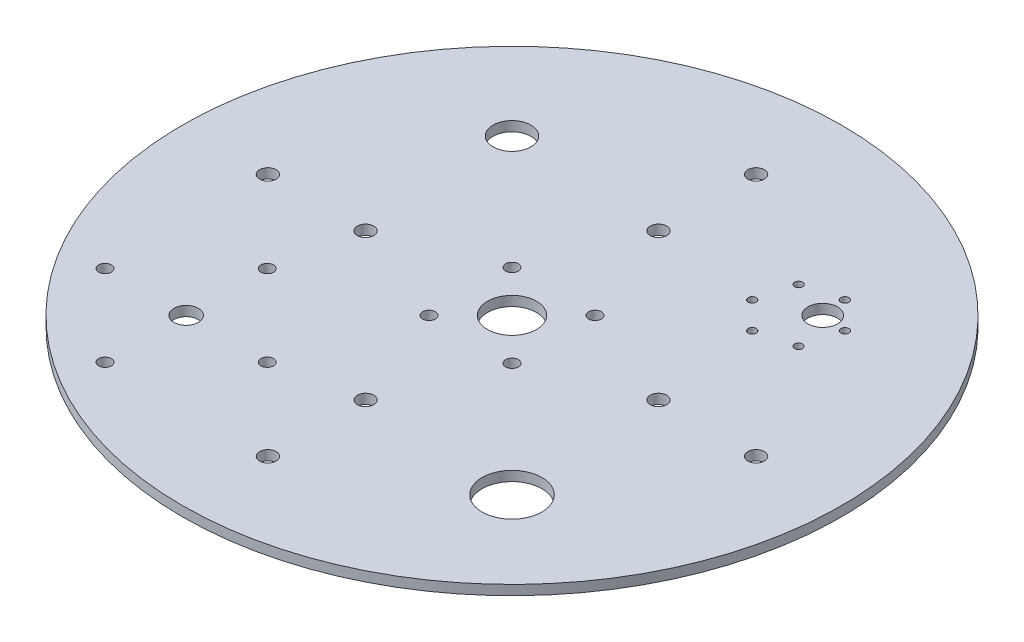
ISO-10303-21;
HEADER;
FILE_DESCRIPTION(('STEP AP214'),'2;1');
FILE_NAME('part.step','',(''),(''),'','','');
FILE_SCHEMA(('AUTOMOTIVE_DESIGN { 1 0 10303 214 1 1 1 1 }'));
ENDSEC;
DATA;
#1=APPLICATION_CONTEXT('core data for automotive mechanical design processes');
#2=APPLICATION_PROTOCOL_DEFINITION('international standard','automotive_design',2000,#1);
#3=PRODUCT_CONTEXT('',#1,'mechanical');
#4=PRODUCT('Part','Part','',(#3));
#5=PRODUCT_RELATED_PRODUCT_CATEGORY('part','',(#4));
#6=PRODUCT_DEFINITION_FORMATION('','',#4);
#7=PRODUCT_DEFINITION_CONTEXT('part definition',#1,'design');
#8=PRODUCT_DEFINITION('design','',#6,#7);
#9=PRODUCT_DEFINITION_SHAPE('','',#8);
#10=(LENGTH_UNIT() NAMED_UNIT(*) SI_UNIT(.MILLI.,.METRE.));
#11=(NAMED_UNIT(*) PLANE_ANGLE_UNIT() SI_UNIT($,.RADIAN.));
#12=(NAMED_UNIT(*) SI_UNIT($,.STERADIAN.) SOLID_ANGLE_UNIT());
#13=UNCERTAINTY_MEASURE_WITH_UNIT(LENGTH_MEASURE(1.E-05),#10,'distance_accuracy_value','');
#14=(GEOMETRIC_REPRESENTATION_CONTEXT(3) GLOBAL_UNCERTAINTY_ASSIGNED_CONTEXT((#13)) GLOBAL_UNIT_ASSIGNED_CONTEXT((#10,
#11,#12)) REPRESENTATION_CONTEXT('',''));
#15=CARTESIAN_POINT('',(0.,0.,0.));
#16=DIRECTION('',(0.,0.,1.));
#17=DIRECTION('',(1.,0.,0.));
#18=AXIS2_PLACEMENT_3D('',#15,#16,#17);
#19=CARTESIAN_POINT('',(0.,-4.,0.));
#20=DIRECTION('',(0.,1.,0.));
#21=DIRECTION('',(0.,0.,1.));
#22=AXIS2_PLACEMENT_3D('',#19,#20,#21);
#23=CYLINDRICAL_SURFACE('',#22,135.);
#24=CARTESIAN_POINT('',(0.,-4.,0.));
#25=DIRECTION('',(0.,1.,0.));
#26=DIRECTION('',(0.,0.,1.));
#27=AXIS2_PLACEMENT_3D('',#24,#25,#26);
#28=CIRCLE('',#27,135.);
#29=CARTESIAN_POINT('',(0.,-4.,135.));
#30=VERTEX_POINT('',#29);
#31=EDGE_CURVE('E10',#30,#30,#28,.T.);
#32=ORIENTED_EDGE('',*,*,#31,.T.);
#33=EDGE_LOOP('',(#32));
#34=FACE_BOUND('',#33,.T.);
#35=CARTESIAN_POINT('',(0.,0.,0.));
#36=DIRECTION('',(0.,1.,0.));
#37=DIRECTION('',(0.,0.,1.));
#38=AXIS2_PLACEMENT_3D('',#35,#36,#37);
#39=CIRCLE('',#38,135.);
#40=CARTESIAN_POINT('',(0.,0.,135.));
#41=VERTEX_POINT('',#40);
#42=EDGE_CURVE('E41',#41,#41,#39,.T.);
#43=ORIENTED_EDGE('',*,*,#42,.F.);
#44=EDGE_LOOP('',(#43));
#45=FACE_BOUND('',#44,.T.);
#46=ADVANCED_FACE('F38',(#34,#45),#23,.T.);
#47=CARTESIAN_POINT('',(0.,-4.,0.));
#48=DIRECTION('',(0.,1.,0.));
#49=DIRECTION('',(0.,0.,1.));
#50=AXIS2_PLACEMENT_3D('',#47,#48,#49);
#51=PLANE('',#50);
#52=CARTESIAN_POINT('',(-66.7446383646597,-4.,66.7446383646597));
#53=DIRECTION('',(0.,1.,0.));
#54=DIRECTION('',(0.,0.,1.));
#55=AXIS2_PLACEMENT_3D('',#52,#53,#54);
#56=CIRCLE('',#55,5.00000000000001);
#57=CARTESIAN_POINT('',(-66.7446383646597,-4.,71.7446383646597));
#58=VERTEX_POINT('',#57);
#59=EDGE_CURVE('E205',#58,#58,#56,.T.);
#60=ORIENTED_EDGE('',*,*,#59,.T.);
#61=EDGE_LOOP('',(#60));
#62=FACE_BOUND('',#61,.T.);
#63=CARTESIAN_POINT('',(-33.510619648892,-4.,66.7446383646597));
#64=DIRECTION('',(0.,1.,0.));
#65=DIRECTION('',(0.,0.,1.));
#66=AXIS2_PLACEMENT_3D('',#63,#64,#65);
#67=CIRCLE('',#66,2.59999999999999);
#68=CARTESIAN_POINT('',(-33.510619648892,-4.,69.3446383646597));
#69=VERTEX_POINT('',#68);
#70=EDGE_CURVE('E199',#69,#69,#67,.T.);
#71=ORIENTED_EDGE('',*,*,#70,.T.);
#72=EDGE_LOOP('',(#71));
#73=FACE_BOUND('',#72,.T.);
#74=CARTESIAN_POINT('',(-66.7446383646597,-4.,99.9786570804274));
#75=DIRECTION('',(0.,1.,0.));
#76=DIRECTION('',(0.,0.,1.));
#77=AXIS2_PLACEMENT_3D('',#74,#75,#76);
#78=CIRCLE('',#77,2.6);
#79=CARTESIAN_POINT('',(-66.7446383646597,-4.,102.578657080427));
#80=VERTEX_POINT('',#79);
#81=EDGE_CURVE('E193',#80,#80,#78,.T.);
#82=ORIENTED_EDGE('',*,*,#81,.T.);
#83=EDGE_LOOP('',(#82));
#84=FACE_BOUND('',#83,.T.);
#85=CARTESIAN_POINT('',(-99.9786570804275,-4.,66.7446383646597));
#86=DIRECTION('',(0.,1.,0.));
#87=DIRECTION('',(0.,0.,1.));
#88=AXIS2_PLACEMENT_3D('',#85,#86,#87);
#89=CIRCLE('',#88,2.6);
#90=CARTESIAN_POINT('',(-99.9786570804275,-4.,69.3446383646597));
#91=VERTEX_POINT('',#90);
#92=EDGE_CURVE('E187',#91,#91,#89,.T.);
#93=ORIENTED_EDGE('',*,*,#92,.T.);
#94=EDGE_LOOP('',(#93));
#95=FACE_BOUND('',#94,.T.);
#96=CARTESIAN_POINT('',(-66.7446383646597,-4.,33.510619648892));
#97=DIRECTION('',(0.,1.,0.));
#98=DIRECTION('',(0.,0.,1.));
#99=AXIS2_PLACEMENT_3D('',#96,#97,#98);
#100=CIRCLE('',#99,2.6);
#101=CARTESIAN_POINT('',(-66.7446383646597,-4.,36.110619648892));
#102=VERTEX_POINT('',#101);
#103=EDGE_CURVE('E181',#102,#102,#100,.T.);
#104=ORIENTED_EDGE('',*,*,#103,.T.);
#105=EDGE_LOOP('',(#104));
#106=FACE_BOUND('',#105,.T.);
#107=CARTESIAN_POINT('',(17.,-4.,-17.));
#108=DIRECTION('',(0.,1.,0.));
#109=DIRECTION('',(0.,0.,1.));
#110=AXIS2_PLACEMENT_3D('',#107,#108,#109);
#111=CIRCLE('',#110,2.6);
#112=CARTESIAN_POINT('',(17.,-4.,-14.4));
#113=VERTEX_POINT('',#112);
#114=EDGE_CURVE('E175',#113,#113,#111,.T.);
#115=ORIENTED_EDGE('',*,*,#114,.T.);
#116=EDGE_LOOP('',(#115));
#117=FACE_BOUND('',#116,.T.);
#118=CARTESIAN_POINT('',(-17.,-4.,-17.));
#119=DIRECTION('',(0.,1.,0.));
#120=DIRECTION('',(0.,0.,1.));
#121=AXIS2_PLACEMENT_3D('',#118,#119,#120);
#122=CIRCLE('',#121,2.6);
#123=CARTESIAN_POINT('',(-17.,-4.,-14.4));
#124=VERTEX_POINT('',#123);
#125=EDGE_CURVE('E169',#124,#124,#122,.T.);
#126=ORIENTED_EDGE('',*,*,#125,.T.);
#127=EDGE_LOOP('',(#126));
#128=FACE_BOUND('',#127,.T.);
#129=CARTESIAN_POINT('',(-17.,-4.,17.));
#130=DIRECTION('',(0.,1.,0.));
#131=DIRECTION('',(0.,0.,1.));
#132=AXIS2_PLACEMENT_3D('',#129,#130,#131);
#133=CIRCLE('',#132,2.6);
#134=CARTESIAN_POINT('',(-17.,-4.,19.6));
#135=VERTEX_POINT('',#134);
#136=EDGE_CURVE('E163',#135,#135,#133,.T.);
#137=ORIENTED_EDGE('',*,*,#136,.T.);
#138=EDGE_LOOP('',(#137));
#139=FACE_BOUND('',#138,.T.);
#140=CARTESIAN_POINT('',(17.,-4.,17.));
#141=DIRECTION('',(0.,1.,0.));
#142=DIRECTION('',(0.,0.,1.));
#143=AXIS2_PLACEMENT_3D('',#140,#141,#142);
#144=CIRCLE('',#143,2.6);
#145=CARTESIAN_POINT('',(17.,-4.,19.6));
#146=VERTEX_POINT('',#145);
#147=EDGE_CURVE('E157',#146,#146,#144,.T.);
#148=ORIENTED_EDGE('',*,*,#147,.T.);
#149=EDGE_LOOP('',(#148));
#150=FACE_BOUND('',#149,.T.);
#151=CARTESIAN_POINT('',(0.,-4.,0.));
#152=DIRECTION('',(0.,1.,0.));
#153=DIRECTION('',(0.,0.,1.));
#154=AXIS2_PLACEMENT_3D('',#151,#152,#153);
#155=CIRCLE('',#154,10.05);
#156=CARTESIAN_POINT('',(0.,-4.,10.05));
#157=VERTEX_POINT('',#156);
#158=EDGE_CURVE('E151',#157,#157,#155,.T.);
#159=ORIENTED_EDGE('',*,*,#158,.T.);
#160=EDGE_LOOP('',(#159));
#161=FACE_BOUND('',#160,.T.);
#162=CARTESIAN_POINT('',(100.,-4.,0.));
#163=DIRECTION('',(0.,1.,0.));
#164=DIRECTION('',(0.,0.,1.));
#165=AXIS2_PLACEMENT_3D('',#162,#163,#164);
#166=CIRCLE('',#165,3.3782);
#167=CARTESIAN_POINT('',(100.,-4.,3.3782));
#168=VERTEX_POINT('',#167);
#169=EDGE_CURVE('E145',#168,#168,#166,.T.);
#170=ORIENTED_EDGE('',*,*,#169,.T.);
#171=EDGE_LOOP('',(#170));
#172=FACE_BOUND('',#171,.T.);
#173=CARTESIAN_POINT('',(60.,-4.,0.));
#174=DIRECTION('',(0.,1.,0.));
#175=DIRECTION('',(0.,0.,1.));
#176=AXIS2_PLACEMENT_3D('',#173,#174,#175);
#177=CIRCLE('',#176,3.3782);
#178=CARTESIAN_POINT('',(60.,-4.,3.37820000000001));
#179=VERTEX_POINT('',#178);
#180=EDGE_CURVE('E139',#179,#179,#177,.T.);
#181=ORIENTED_EDGE('',*,*,#180,.T.);
#182=EDGE_LOOP('',(#181));
#183=FACE_BOUND('',#182,.T.);
#184=CARTESIAN_POINT('',(0.,-4.,100.));
#185=DIRECTION('',(0.,1.,0.));
#186=DIRECTION('',(0.,0.,1.));
#187=AXIS2_PLACEMENT_3D('',#184,#185,#186);
#188=CIRCLE('',#187,3.3782);
#189=CARTESIAN_POINT('',(0.,-4.,103.3782));
#190=VERTEX_POINT('',#189);
#191=EDGE_CURVE('E133',#190,#190,#188,.T.);
#192=ORIENTED_EDGE('',*,*,#191,.T.);
#193=EDGE_LOOP('',(#192));
#194=FACE_BOUND('',#193,.T.);
#195=CARTESIAN_POINT('',(-2.20510701522914E-13,-4.,60.));
#196=DIRECTION('',(0.,1.,0.));
#197=DIRECTION('',(0.,0.,1.));
#198=AXIS2_PLACEMENT_3D('',#195,#196,#197);
#199=CIRCLE('',#198,3.3782);
#200=CARTESIAN_POINT('',(-2.20510701522914E-13,-4.,63.3782));
#201=VERTEX_POINT('',#200);
#202=EDGE_CURVE('E127',#201,#201,#199,.T.);
#203=ORIENTED_EDGE('',*,*,#202,.T.);
#204=EDGE_LOOP('',(#203));
#205=FACE_BOUND('',#204,.T.);
#206=CARTESIAN_POINT('',(-100.,-4.,0.));
#207=DIRECTION('',(0.,1.,0.));
#208=DIRECTION('',(0.,0.,1.));
#209=AXIS2_PLACEMENT_3D('',#206,#207,#208);
#210=CIRCLE('',#209,3.3782);
#211=CARTESIAN_POINT('',(-100.,-4.,3.37820000000001));
#212=VERTEX_POINT('',#211);
#213=EDGE_CURVE('E121',#212,#212,#210,.T.);
#214=ORIENTED_EDGE('',*,*,#213,.T.);
#215=EDGE_LOOP('',(#214));
#216=FACE_BOUND('',#215,.T.);
#217=CARTESIAN_POINT('',(-60.,-4.,-4.29999581853502E-13));
#218=DIRECTION('',(0.,1.,0.));
#219=DIRECTION('',(0.,0.,1.));
#220=AXIS2_PLACEMENT_3D('',#217,#218,#219);
#221=CIRCLE('',#220,3.3782);
#222=CARTESIAN_POINT('',(-60.,-4.,3.37819999999957));
#223=VERTEX_POINT('',#222);
#224=EDGE_CURVE('E115',#223,#223,#221,.T.);
#225=ORIENTED_EDGE('',*,*,#224,.T.);
#226=EDGE_LOOP('',(#225));
#227=FACE_BOUND('',#226,.T.);
#228=CARTESIAN_POINT('',(0.,-4.,-100.));
#229=DIRECTION('',(0.,1.,0.));
#230=DIRECTION('',(0.,0.,1.));
#231=AXIS2_PLACEMENT_3D('',#228,#229,#230);
#232=CIRCLE('',#231,3.3782);
#233=CARTESIAN_POINT('',(0.,-4.,-96.6218));
#234=VERTEX_POINT('',#233);
#235=EDGE_CURVE('E109',#234,#234,#232,.T.);
#236=ORIENTED_EDGE('',*,*,#235,.T.);
#237=EDGE_LOOP('',(#236));
#238=FACE_BOUND('',#237,.T.);
#239=CARTESIAN_POINT('',(6.32549568280183E-13,-4.,-60.));
#240=DIRECTION('',(0.,1.,0.));
#241=DIRECTION('',(0.,0.,1.));
#242=AXIS2_PLACEMENT_3D('',#239,#240,#241);
#243=CIRCLE('',#242,3.3782);
#244=CARTESIAN_POINT('',(6.32549568280183E-13,-4.,-56.6218));
#245=VERTEX_POINT('',#244);
#246=EDGE_CURVE('E103',#245,#245,#243,.T.);
#247=ORIENTED_EDGE('',*,*,#246,.T.);
#248=EDGE_LOOP('',(#247));
#249=FACE_BOUND('',#248,.T.);
#250=CARTESIAN_POINT('',(54.6781676393946,-4.,-43.7180125310026));
#251=DIRECTION('',(0.,1.,0.));
#252=DIRECTION('',(0.,0.,1.));
#253=AXIS2_PLACEMENT_3D('',#250,#251,#252);
#254=CIRCLE('',#253,1.65);
#255=CARTESIAN_POINT('',(54.6781676393946,-4.,-42.0680125310026));
#256=VERTEX_POINT('',#255);
#257=EDGE_CURVE('E97',#256,#256,#254,.T.);
#258=ORIENTED_EDGE('',*,*,#257,.T.);
#259=EDGE_LOOP('',(#258));
#260=FACE_BOUND('',#259,.T.);
#261=CARTESIAN_POINT('',(69.6500179468752,-4.,-47.7297077300916));
#262=DIRECTION('',(0.,1.,0.));
#263=DIRECTION('',(0.,0.,1.));
#264=AXIS2_PLACEMENT_3D('',#261,#262,#263);
#265=CIRCLE('',#264,1.65);
#266=CARTESIAN_POINT('',(69.6500179468752,-4.,-46.0797077300916));
#267=VERTEX_POINT('',#266);
#268=EDGE_CURVE('E91',#267,#267,#265,.T.);
#269=ORIENTED_EDGE('',*,*,#268,.T.);
#270=EDGE_LOOP('',(#269));
#271=FACE_BOUND('',#270,.T.);
#272=CARTESIAN_POINT('',(47.7297077300923,-4.,-69.6500179468747));
#273=DIRECTION('',(0.,1.,0.));
#274=DIRECTION('',(0.,0.,1.));
#275=AXIS2_PLACEMENT_3D('',#272,#273,#274);
#276=CIRCLE('',#275,1.65);
#277=CARTESIAN_POINT('',(47.7297077300923,-4.,-68.0000179468747));
#278=VERTEX_POINT('',#277);
#279=EDGE_CURVE('E85',#278,#278,#276,.T.);
#280=ORIENTED_EDGE('',*,*,#279,.T.);
#281=EDGE_LOOP('',(#280));
#282=FACE_BOUND('',#281,.T.);
#283=CARTESIAN_POINT('',(62.7015580375729,-4.,-73.6617131459636));
#284=DIRECTION('',(0.,1.,0.));
#285=DIRECTION('',(0.,0.,1.));
#286=AXIS2_PLACEMENT_3D('',#283,#284,#285);
#287=CIRCLE('',#286,1.65);
#288=CARTESIAN_POINT('',(62.7015580375729,-4.,-72.0117131459636));
#289=VERTEX_POINT('',#288);
#290=EDGE_CURVE('E79',#289,#289,#287,.T.);
#291=ORIENTED_EDGE('',*,*,#290,.T.);
#292=EDGE_LOOP('',(#291));
#293=FACE_BOUND('',#292,.T.);
#294=CARTESIAN_POINT('',(73.6617131459643,-4.,-62.7015580375721));
#295=DIRECTION('',(0.,1.,0.));
#296=DIRECTION('',(0.,0.,1.));
#297=AXIS2_PLACEMENT_3D('',#294,#295,#296);
#298=CIRCLE('',#297,1.65);
#299=CARTESIAN_POINT('',(73.6617131459643,-4.,-61.0515580375721));
#300=VERTEX_POINT('',#299);
#301=EDGE_CURVE('E73',#300,#300,#298,.T.);
#302=ORIENTED_EDGE('',*,*,#301,.T.);
#303=EDGE_LOOP('',(#302));
#304=FACE_BOUND('',#303,.T.);
#305=CARTESIAN_POINT('',(43.7180125310032,-4.,-54.6781676393941));
#306=DIRECTION('',(0.,1.,0.));
#307=DIRECTION('',(0.,0.,1.));
#308=AXIS2_PLACEMENT_3D('',#305,#306,#307);
#309=CIRCLE('',#308,1.65);
#310=CARTESIAN_POINT('',(43.7180125310032,-4.,-53.0281676393941));
#311=VERTEX_POINT('',#310);
#312=EDGE_CURVE('E67',#311,#311,#309,.T.);
#313=ORIENTED_EDGE('',*,*,#312,.T.);
#314=EDGE_LOOP('',(#313));
#315=FACE_BOUND('',#314,.T.);
#316=CARTESIAN_POINT('',(-63.6396103067873,-4.,-63.6396103067879));
#317=DIRECTION('',(0.,1.,0.));
#318=DIRECTION('',(0.,0.,1.));
#319=AXIS2_PLACEMENT_3D('',#316,#317,#318);
#320=CIRCLE('',#319,7.74999999999789);
#321=CARTESIAN_POINT('',(-63.6396103067873,-4.,-55.88961030679));
#322=VERTEX_POINT('',#321);
#323=EDGE_CURVE('E61',#322,#322,#320,.T.);
#324=ORIENTED_EDGE('',*,*,#323,.T.);
#325=EDGE_LOOP('',(#324));
#326=FACE_BOUND('',#325,.T.);
#327=CARTESIAN_POINT('',(63.6396103067906,-4.,63.6396103067913));
#328=DIRECTION('',(0.,1.,0.));
#329=DIRECTION('',(0.,0.,1.));
#330=AXIS2_PLACEMENT_3D('',#327,#328,#329);
#331=CIRCLE('',#330,12.2500000000021);
#332=CARTESIAN_POINT('',(63.6396103067906,-4.,75.8896103067933));
#333=VERTEX_POINT('',#332);
#334=EDGE_CURVE('E55',#333,#333,#331,.T.);
#335=ORIENTED_EDGE('',*,*,#334,.T.);
#336=EDGE_LOOP('',(#335));
#337=FACE_BOUND('',#336,.T.);
#338=CARTESIAN_POINT('',(63.6396103067896,-4.,-63.6396103067889));
#339=DIRECTION('',(0.,1.,0.));
#340=DIRECTION('',(0.,0.,1.));
#341=AXIS2_PLACEMENT_3D('',#338,#339,#340);
#342=CIRCLE('',#341,6.05);
#343=CARTESIAN_POINT('',(63.6396103067896,-4.,-57.5896103067889));
#344=VERTEX_POINT('',#343);
#345=EDGE_CURVE('E48',#344,#344,#342,.T.);
#346=ORIENTED_EDGE('',*,*,#345,.T.);
#347=EDGE_LOOP('',(#346));
#348=FACE_BOUND('',#347,.T.);
#349=ORIENTED_EDGE('',*,*,#31,.F.);
#350=EDGE_LOOP('',(#349));
#351=FACE_BOUND('',#350,.T.);
#352=ADVANCED_FACE('F212',(#62,#73,#84,#95,#106,#117,#128,#139,#150,#161,#172,#183,#194,#205,
#216,#227,#238,#249,#260,#271,#282,#293,#304,#315,#326,#337,#348,#351),#51,.F.);
#353=CARTESIAN_POINT('',(0.,0.,0.));
#354=DIRECTION('',(0.,1.,0.));
#355=DIRECTION('',(0.,0.,1.));
#356=AXIS2_PLACEMENT_3D('',#353,#354,#355);
#357=PLANE('',#356);
#358=CARTESIAN_POINT('',(-66.7446383646597,0.,66.7446383646597));
#359=DIRECTION('',(0.,1.,0.));
#360=DIRECTION('',(0.,0.,1.));
#361=AXIS2_PLACEMENT_3D('',#358,#359,#360);
#362=CIRCLE('',#361,5.00000000000001);
#363=CARTESIAN_POINT('',(-66.7446383646597,0.,71.7446383646597));
#364=VERTEX_POINT('',#363);
#365=EDGE_CURVE('E206',#364,#364,#362,.T.);
#366=ORIENTED_EDGE('',*,*,#365,.F.);
#367=EDGE_LOOP('',(#366));
#368=FACE_BOUND('',#367,.T.);
#369=CARTESIAN_POINT('',(-33.510619648892,0.,66.7446383646597));
#370=DIRECTION('',(0.,1.,0.));
#371=DIRECTION('',(0.,0.,1.));
#372=AXIS2_PLACEMENT_3D('',#369,#370,#371);
#373=CIRCLE('',#372,2.59999999999999);
#374=CARTESIAN_POINT('',(-33.510619648892,0.,69.3446383646597));
#375=VERTEX_POINT('',#374);
#376=EDGE_CURVE('E202',#375,#375,#373,.T.);
#377=ORIENTED_EDGE('',*,*,#376,.F.);
#378=EDGE_LOOP('',(#377));
#379=FACE_BOUND('',#378,.T.);
#380=CARTESIAN_POINT('',(-66.7446383646597,0.,99.9786570804274));
#381=DIRECTION('',(0.,1.,0.));
#382=DIRECTION('',(0.,0.,1.));
#383=AXIS2_PLACEMENT_3D('',#380,#381,#382);
#384=CIRCLE('',#383,2.59999999999999);
#385=CARTESIAN_POINT('',(-66.7446383646597,0.,102.578657080427));
#386=VERTEX_POINT('',#385);
#387=EDGE_CURVE('E196',#386,#386,#384,.T.);
#388=ORIENTED_EDGE('',*,*,#387,.F.);
#389=EDGE_LOOP('',(#388));
#390=FACE_BOUND('',#389,.T.);
#391=CARTESIAN_POINT('',(-99.9786570804275,0.,66.7446383646597));
#392=DIRECTION('',(0.,1.,0.));
#393=DIRECTION('',(0.,0.,1.));
#394=AXIS2_PLACEMENT_3D('',#391,#392,#393);
#395=CIRCLE('',#394,2.59999999999999);
#396=CARTESIAN_POINT('',(-99.9786570804275,0.,69.3446383646597));
#397=VERTEX_POINT('',#396);
#398=EDGE_CURVE('E190',#397,#397,#395,.T.);
#399=ORIENTED_EDGE('',*,*,#398,.F.);
#400=EDGE_LOOP('',(#399));
#401=FACE_BOUND('',#400,.T.);
#402=CARTESIAN_POINT('',(-66.7446383646597,0.,33.510619648892));
#403=DIRECTION('',(0.,1.,0.));
#404=DIRECTION('',(0.,0.,1.));
#405=AXIS2_PLACEMENT_3D('',#402,#403,#404);
#406=CIRCLE('',#405,2.59999999999999);
#407=CARTESIAN_POINT('',(-66.7446383646597,0.,36.110619648892));
#408=VERTEX_POINT('',#407);
#409=EDGE_CURVE('E184',#408,#408,#406,.T.);
#410=ORIENTED_EDGE('',*,*,#409,.F.);
#411=EDGE_LOOP('',(#410));
#412=FACE_BOUND('',#411,.T.);
#413=CARTESIAN_POINT('',(17.,0.,-17.));
#414=DIRECTION('',(0.,1.,0.));
#415=DIRECTION('',(0.,0.,1.));
#416=AXIS2_PLACEMENT_3D('',#413,#414,#415);
#417=CIRCLE('',#416,2.6);
#418=CARTESIAN_POINT('',(17.,0.,-14.4));
#419=VERTEX_POINT('',#418);
#420=EDGE_CURVE('E178',#419,#419,#417,.T.);
#421=ORIENTED_EDGE('',*,*,#420,.F.);
#422=EDGE_LOOP('',(#421));
#423=FACE_BOUND('',#422,.T.);
#424=CARTESIAN_POINT('',(-17.,0.,-17.));
#425=DIRECTION('',(0.,1.,0.));
#426=DIRECTION('',(0.,0.,1.));
#427=AXIS2_PLACEMENT_3D('',#424,#425,#426);
#428=CIRCLE('',#427,2.6);
#429=CARTESIAN_POINT('',(-17.,0.,-14.4));
#430=VERTEX_POINT('',#429);
#431=EDGE_CURVE('E172',#430,#430,#428,.T.);
#432=ORIENTED_EDGE('',*,*,#431,.F.);
#433=EDGE_LOOP('',(#432));
#434=FACE_BOUND('',#433,.T.);
#435=CARTESIAN_POINT('',(-17.,0.,17.));
#436=DIRECTION('',(0.,1.,0.));
#437=DIRECTION('',(0.,0.,1.));
#438=AXIS2_PLACEMENT_3D('',#435,#436,#437);
#439=CIRCLE('',#438,2.6);
#440=CARTESIAN_POINT('',(-17.,0.,19.6));
#441=VERTEX_POINT('',#440);
#442=EDGE_CURVE('E166',#441,#441,#439,.T.);
#443=ORIENTED_EDGE('',*,*,#442,.F.);
#444=EDGE_LOOP('',(#443));
#445=FACE_BOUND('',#444,.T.);
#446=CARTESIAN_POINT('',(17.,0.,17.));
#447=DIRECTION('',(0.,1.,0.));
#448=DIRECTION('',(0.,0.,1.));
#449=AXIS2_PLACEMENT_3D('',#446,#447,#448);
#450=CIRCLE('',#449,2.6);
#451=CARTESIAN_POINT('',(17.,0.,19.6));
#452=VERTEX_POINT('',#451);
#453=EDGE_CURVE('E160',#452,#452,#450,.T.);
#454=ORIENTED_EDGE('',*,*,#453,.F.);
#455=EDGE_LOOP('',(#454));
#456=FACE_BOUND('',#455,.T.);
#457=CARTESIAN_POINT('',(0.,0.,0.));
#458=DIRECTION('',(0.,1.,0.));
#459=DIRECTION('',(0.,0.,1.));
#460=AXIS2_PLACEMENT_3D('',#457,#458,#459);
#461=CIRCLE('',#460,10.05);
#462=CARTESIAN_POINT('',(0.,0.,10.05));
#463=VERTEX_POINT('',#462);
#464=EDGE_CURVE('E154',#463,#463,#461,.T.);
#465=ORIENTED_EDGE('',*,*,#464,.F.);
#466=EDGE_LOOP('',(#465));
#467=FACE_BOUND('',#466,.T.);
#468=CARTESIAN_POINT('',(100.,0.,0.));
#469=DIRECTION('',(0.,1.,0.));
#470=DIRECTION('',(0.,0.,1.));
#471=AXIS2_PLACEMENT_3D('',#468,#469,#470);
#472=CIRCLE('',#471,3.3782);
#473=CARTESIAN_POINT('',(100.,0.,3.3782));
#474=VERTEX_POINT('',#473);
#475=EDGE_CURVE('E148',#474,#474,#472,.T.);
#476=ORIENTED_EDGE('',*,*,#475,.F.);
#477=EDGE_LOOP('',(#476));
#478=FACE_BOUND('',#477,.T.);
#479=CARTESIAN_POINT('',(60.,0.,0.));
#480=DIRECTION('',(0.,1.,0.));
#481=DIRECTION('',(0.,0.,1.));
#482=AXIS2_PLACEMENT_3D('',#479,#480,#481);
#483=CIRCLE('',#482,3.3782);
#484=CARTESIAN_POINT('',(60.,0.,3.37820000000001));
#485=VERTEX_POINT('',#484);
#486=EDGE_CURVE('E142',#485,#485,#483,.T.);
#487=ORIENTED_EDGE('',*,*,#486,.F.);
#488=EDGE_LOOP('',(#487));
#489=FACE_BOUND('',#488,.T.);
#490=CARTESIAN_POINT('',(0.,0.,100.));
#491=DIRECTION('',(0.,1.,0.));
#492=DIRECTION('',(0.,0.,1.));
#493=AXIS2_PLACEMENT_3D('',#490,#491,#492);
#494=CIRCLE('',#493,3.3782);
#495=CARTESIAN_POINT('',(0.,0.,103.3782));
#496=VERTEX_POINT('',#495);
#497=EDGE_CURVE('E136',#496,#496,#494,.T.);
#498=ORIENTED_EDGE('',*,*,#497,.F.);
#499=EDGE_LOOP('',(#498));
#500=FACE_BOUND('',#499,.T.);
#501=CARTESIAN_POINT('',(-2.20510701522914E-13,0.,60.));
#502=DIRECTION('',(0.,1.,0.));
#503=DIRECTION('',(0.,0.,1.));
#504=AXIS2_PLACEMENT_3D('',#501,#502,#503);
#505=CIRCLE('',#504,3.3782);
#506=CARTESIAN_POINT('',(-2.20510701522914E-13,0.,63.3782));
#507=VERTEX_POINT('',#506);
#508=EDGE_CURVE('E130',#507,#507,#505,.T.);
#509=ORIENTED_EDGE('',*,*,#508,.F.);
#510=EDGE_LOOP('',(#509));
#511=FACE_BOUND('',#510,.T.);
#512=CARTESIAN_POINT('',(-100.,0.,0.));
#513=DIRECTION('',(0.,1.,0.));
#514=DIRECTION('',(0.,0.,1.));
#515=AXIS2_PLACEMENT_3D('',#512,#513,#514);
#516=CIRCLE('',#515,3.3782);
#517=CARTESIAN_POINT('',(-100.,0.,3.37820000000001));
#518=VERTEX_POINT('',#517);
#519=EDGE_CURVE('E124',#518,#518,#516,.T.);
#520=ORIENTED_EDGE('',*,*,#519,.F.);
#521=EDGE_LOOP('',(#520));
#522=FACE_BOUND('',#521,.T.);
#523=CARTESIAN_POINT('',(-60.,0.,-4.29999581853502E-13));
#524=DIRECTION('',(0.,1.,0.));
#525=DIRECTION('',(0.,0.,1.));
#526=AXIS2_PLACEMENT_3D('',#523,#524,#525);
#527=CIRCLE('',#526,3.3782);
#528=CARTESIAN_POINT('',(-60.,0.,3.37819999999957));
#529=VERTEX_POINT('',#528);
#530=EDGE_CURVE('E118',#529,#529,#527,.T.);
#531=ORIENTED_EDGE('',*,*,#530,.F.);
#532=EDGE_LOOP('',(#531));
#533=FACE_BOUND('',#532,.T.);
#534=CARTESIAN_POINT('',(0.,0.,-100.));
#535=DIRECTION('',(0.,1.,0.));
#536=DIRECTION('',(0.,0.,1.));
#537=AXIS2_PLACEMENT_3D('',#534,#535,#536);
#538=CIRCLE('',#537,3.3782);
#539=CARTESIAN_POINT('',(0.,0.,-96.6218));
#540=VERTEX_POINT('',#539);
#541=EDGE_CURVE('E112',#540,#540,#538,.T.);
#542=ORIENTED_EDGE('',*,*,#541,.F.);
#543=EDGE_LOOP('',(#542));
#544=FACE_BOUND('',#543,.T.);
#545=CARTESIAN_POINT('',(6.32549568280183E-13,0.,-60.));
#546=DIRECTION('',(0.,1.,0.));
#547=DIRECTION('',(0.,0.,1.));
#548=AXIS2_PLACEMENT_3D('',#545,#546,#547);
#549=CIRCLE('',#548,3.3782);
#550=CARTESIAN_POINT('',(6.32549568280183E-13,0.,-56.6218));
#551=VERTEX_POINT('',#550);
#552=EDGE_CURVE('E106',#551,#551,#549,.T.);
#553=ORIENTED_EDGE('',*,*,#552,.F.);
#554=EDGE_LOOP('',(#553));
#555=FACE_BOUND('',#554,.T.);
#556=CARTESIAN_POINT('',(54.6781676393946,0.,-43.7180125310026));
#557=DIRECTION('',(0.,1.,0.));
#558=DIRECTION('',(0.,0.,1.));
#559=AXIS2_PLACEMENT_3D('',#556,#557,#558);
#560=CIRCLE('',#559,1.65);
#561=CARTESIAN_POINT('',(54.6781676393946,0.,-42.0680125310026));
#562=VERTEX_POINT('',#561);
#563=EDGE_CURVE('E100',#562,#562,#560,.T.);
#564=ORIENTED_EDGE('',*,*,#563,.F.);
#565=EDGE_LOOP('',(#564));
#566=FACE_BOUND('',#565,.T.);
#567=CARTESIAN_POINT('',(69.6500179468752,0.,-47.7297077300916));
#568=DIRECTION('',(0.,1.,0.));
#569=DIRECTION('',(0.,0.,1.));
#570=AXIS2_PLACEMENT_3D('',#567,#568,#569);
#571=CIRCLE('',#570,1.65);
#572=CARTESIAN_POINT('',(69.6500179468752,0.,-46.0797077300916));
#573=VERTEX_POINT('',#572);
#574=EDGE_CURVE('E94',#573,#573,#571,.T.);
#575=ORIENTED_EDGE('',*,*,#574,.F.);
#576=EDGE_LOOP('',(#575));
#577=FACE_BOUND('',#576,.T.);
#578=CARTESIAN_POINT('',(47.7297077300923,0.,-69.6500179468747));
#579=DIRECTION('',(0.,1.,0.));
#580=DIRECTION('',(0.,0.,1.));
#581=AXIS2_PLACEMENT_3D('',#578,#579,#580);
#582=CIRCLE('',#581,1.65);
#583=CARTESIAN_POINT('',(47.7297077300923,0.,-68.0000179468747));
#584=VERTEX_POINT('',#583);
#585=EDGE_CURVE('E88',#584,#584,#582,.T.);
#586=ORIENTED_EDGE('',*,*,#585,.F.);
#587=EDGE_LOOP('',(#586));
#588=FACE_BOUND('',#587,.T.);
#589=CARTESIAN_POINT('',(62.7015580375729,0.,-73.6617131459636));
#590=DIRECTION('',(0.,1.,0.));
#591=DIRECTION('',(0.,0.,1.));
#592=AXIS2_PLACEMENT_3D('',#589,#590,#591);
#593=CIRCLE('',#592,1.65);
#594=CARTESIAN_POINT('',(62.7015580375729,0.,-72.0117131459636));
#595=VERTEX_POINT('',#594);
#596=EDGE_CURVE('E82',#595,#595,#593,.T.);
#597=ORIENTED_EDGE('',*,*,#596,.F.);
#598=EDGE_LOOP('',(#597));
#599=FACE_BOUND('',#598,.T.);
#600=CARTESIAN_POINT('',(73.6617131459643,0.,-62.7015580375721));
#601=DIRECTION('',(0.,1.,0.));
#602=DIRECTION('',(0.,0.,1.));
#603=AXIS2_PLACEMENT_3D('',#600,#601,#602);
#604=CIRCLE('',#603,1.65);
#605=CARTESIAN_POINT('',(73.6617131459643,0.,-61.0515580375721));
#606=VERTEX_POINT('',#605);
#607=EDGE_CURVE('E76',#606,#606,#604,.T.);
#608=ORIENTED_EDGE('',*,*,#607,.F.);
#609=EDGE_LOOP('',(#608));
#610=FACE_BOUND('',#609,.T.);
#611=CARTESIAN_POINT('',(43.7180125310032,0.,-54.6781676393941));
#612=DIRECTION('',(0.,1.,0.));
#613=DIRECTION('',(0.,0.,1.));
#614=AXIS2_PLACEMENT_3D('',#611,#612,#613);
#615=CIRCLE('',#614,1.65);
#616=CARTESIAN_POINT('',(43.7180125310032,0.,-53.0281676393941));
#617=VERTEX_POINT('',#616);
#618=EDGE_CURVE('E70',#617,#617,#615,.T.);
#619=ORIENTED_EDGE('',*,*,#618,.F.);
#620=EDGE_LOOP('',(#619));
#621=FACE_BOUND('',#620,.T.);
#622=CARTESIAN_POINT('',(-63.6396103067873,0.,-63.6396103067879));
#623=DIRECTION('',(0.,1.,0.));
#624=DIRECTION('',(0.,0.,1.));
#625=AXIS2_PLACEMENT_3D('',#622,#623,#624);
#626=CIRCLE('',#625,7.74999999999789);
#627=CARTESIAN_POINT('',(-63.6396103067873,0.,-55.88961030679));
#628=VERTEX_POINT('',#627);
#629=EDGE_CURVE('E64',#628,#628,#626,.T.);
#630=ORIENTED_EDGE('',*,*,#629,.F.);
#631=EDGE_LOOP('',(#630));
#632=FACE_BOUND('',#631,.T.);
#633=CARTESIAN_POINT('',(63.6396103067906,0.,63.6396103067913));
#634=DIRECTION('',(0.,1.,0.));
#635=DIRECTION('',(0.,0.,1.));
#636=AXIS2_PLACEMENT_3D('',#633,#634,#635);
#637=CIRCLE('',#636,12.2500000000021);
#638=CARTESIAN_POINT('',(63.6396103067906,0.,75.8896103067933));
#639=VERTEX_POINT('',#638);
#640=EDGE_CURVE('E58',#639,#639,#637,.T.);
#641=ORIENTED_EDGE('',*,*,#640,.F.);
#642=EDGE_LOOP('',(#641));
#643=FACE_BOUND('',#642,.T.);
#644=CARTESIAN_POINT('',(63.6396103067896,0.,-63.6396103067889));
#645=DIRECTION('',(0.,1.,0.));
#646=DIRECTION('',(0.,0.,1.));
#647=AXIS2_PLACEMENT_3D('',#644,#645,#646);
#648=CIRCLE('',#647,6.05);
#649=CARTESIAN_POINT('',(63.6396103067896,0.,-57.5896103067889));
#650=VERTEX_POINT('',#649);
#651=EDGE_CURVE('E52',#650,#650,#648,.T.);
#652=ORIENTED_EDGE('',*,*,#651,.F.);
#653=EDGE_LOOP('',(#652));
#654=FACE_BOUND('',#653,.T.);
#655=ORIENTED_EDGE('',*,*,#42,.T.);
#656=EDGE_LOOP('',(#655));
#657=FACE_BOUND('',#656,.T.);
#658=ADVANCED_FACE('F222',(#368,#379,#390,#401,#412,#423,#434,#445,#456,#467,#478,#489,#500,
#511,#522,#533,#544,#555,#566,#577,#588,#599,#610,#621,#632,#643,#654,#657),#357,.T.);
#659=CARTESIAN_POINT('',(63.6396103067896,-10.,-63.6396103067889));
#660=DIRECTION('',(0.,1.,0.));
#661=DIRECTION('',(0.,0.,1.));
#662=AXIS2_PLACEMENT_3D('',#659,#660,#661);
#663=CYLINDRICAL_SURFACE('',#662,6.05);
#664=ORIENTED_EDGE('',*,*,#651,.T.);
#665=EDGE_LOOP('',(#664));
#666=FACE_BOUND('',#665,.T.);
#667=ORIENTED_EDGE('',*,*,#345,.F.);
#668=EDGE_LOOP('',(#667));
#669=FACE_BOUND('',#668,.T.);
#670=ADVANCED_FACE('F225',(#666,#669),#663,.F.);
#671=CARTESIAN_POINT('',(63.6396103067906,-10.,63.6396103067913));
#672=DIRECTION('',(0.,1.,0.));
#673=DIRECTION('',(0.,0.,1.));
#674=AXIS2_PLACEMENT_3D('',#671,#672,#673);
#675=CYLINDRICAL_SURFACE('',#674,12.2500000000021);
#676=ORIENTED_EDGE('',*,*,#640,.T.);
#677=EDGE_LOOP('',(#676));
#678=FACE_BOUND('',#677,.T.);
#679=ORIENTED_EDGE('',*,*,#334,.F.);
#680=EDGE_LOOP('',(#679));
#681=FACE_BOUND('',#680,.T.);
#682=ADVANCED_FACE('F290',(#678,#681),#675,.F.);
#683=CARTESIAN_POINT('',(-63.6396103067873,-10.,-63.6396103067879));
#684=DIRECTION('',(0.,1.,0.));
#685=DIRECTION('',(0.,0.,1.));
#686=AXIS2_PLACEMENT_3D('',#683,#684,#685);
#687=CYLINDRICAL_SURFACE('',#686,7.74999999999789);
#688=ORIENTED_EDGE('',*,*,#629,.T.);
#689=EDGE_LOOP('',(#688));
#690=FACE_BOUND('',#689,.T.);
#691=ORIENTED_EDGE('',*,*,#323,.F.);
#692=EDGE_LOOP('',(#691));
#693=FACE_BOUND('',#692,.T.);
#694=ADVANCED_FACE('F294',(#690,#693),#687,.F.);
#695=CARTESIAN_POINT('',(43.7180125310032,-10.,-54.6781676393941));
#696=DIRECTION('',(0.,1.,0.));
#697=DIRECTION('',(0.,0.,1.));
#698=AXIS2_PLACEMENT_3D('',#695,#696,#697);
#699=CYLINDRICAL_SURFACE('',#698,1.65);
#700=ORIENTED_EDGE('',*,*,#618,.T.);
#701=EDGE_LOOP('',(#700));
#702=FACE_BOUND('',#701,.T.);
#703=ORIENTED_EDGE('',*,*,#312,.F.);
#704=EDGE_LOOP('',(#703));
#705=FACE_BOUND('',#704,.T.);
#706=ADVANCED_FACE('F298',(#702,#705),#699,.F.);
#707=CARTESIAN_POINT('',(73.6617131459643,-10.,-62.7015580375721));
#708=DIRECTION('',(0.,1.,0.));
#709=DIRECTION('',(0.,0.,1.));
#710=AXIS2_PLACEMENT_3D('',#707,#708,#709);
#711=CYLINDRICAL_SURFACE('',#710,1.65);
#712=ORIENTED_EDGE('',*,*,#607,.T.);
#713=EDGE_LOOP('',(#712));
#714=FACE_BOUND('',#713,.T.);
#715=ORIENTED_EDGE('',*,*,#301,.F.);
#716=EDGE_LOOP('',(#715));
#717=FACE_BOUND('',#716,.T.);
#718=ADVANCED_FACE('F302',(#714,#717),#711,.F.);
#719=CARTESIAN_POINT('',(62.7015580375729,-10.,-73.6617131459636));
#720=DIRECTION('',(0.,1.,0.));
#721=DIRECTION('',(0.,0.,1.));
#722=AXIS2_PLACEMENT_3D('',#719,#720,#721);
#723=CYLINDRICAL_SURFACE('',#722,1.65);
#724=ORIENTED_EDGE('',*,*,#596,.T.);
#725=EDGE_LOOP('',(#724));
#726=FACE_BOUND('',#725,.T.);
#727=ORIENTED_EDGE('',*,*,#290,.F.);
#728=EDGE_LOOP('',(#727));
#729=FACE_BOUND('',#728,.T.);
#730=ADVANCED_FACE('F306',(#726,#729),#723,.F.);
#731=CARTESIAN_POINT('',(47.7297077300923,-10.,-69.6500179468747));
#732=DIRECTION('',(0.,1.,0.));
#733=DIRECTION('',(0.,0.,1.));
#734=AXIS2_PLACEMENT_3D('',#731,#732,#733);
#735=CYLINDRICAL_SURFACE('',#734,1.65);
#736=ORIENTED_EDGE('',*,*,#585,.T.);
#737=EDGE_LOOP('',(#736));
#738=FACE_BOUND('',#737,.T.);
#739=ORIENTED_EDGE('',*,*,#279,.F.);
#740=EDGE_LOOP('',(#739));
#741=FACE_BOUND('',#740,.T.);
#742=ADVANCED_FACE('F310',(#738,#741),#735,.F.);
#743=CARTESIAN_POINT('',(69.6500179468752,-10.,-47.7297077300916));
#744=DIRECTION('',(0.,1.,0.));
#745=DIRECTION('',(0.,0.,1.));
#746=AXIS2_PLACEMENT_3D('',#743,#744,#745);
#747=CYLINDRICAL_SURFACE('',#746,1.65);
#748=ORIENTED_EDGE('',*,*,#574,.T.);
#749=EDGE_LOOP('',(#748));
#750=FACE_BOUND('',#749,.T.);
#751=ORIENTED_EDGE('',*,*,#268,.F.);
#752=EDGE_LOOP('',(#751));
#753=FACE_BOUND('',#752,.T.);
#754=ADVANCED_FACE('F314',(#750,#753),#747,.F.);
#755=CARTESIAN_POINT('',(54.6781676393946,-10.,-43.7180125310026));
#756=DIRECTION('',(0.,1.,0.));
#757=DIRECTION('',(0.,0.,1.));
#758=AXIS2_PLACEMENT_3D('',#755,#756,#757);
#759=CYLINDRICAL_SURFACE('',#758,1.65);
#760=ORIENTED_EDGE('',*,*,#563,.T.);
#761=EDGE_LOOP('',(#760));
#762=FACE_BOUND('',#761,.T.);
#763=ORIENTED_EDGE('',*,*,#257,.F.);
#764=EDGE_LOOP('',(#763));
#765=FACE_BOUND('',#764,.T.);
#766=ADVANCED_FACE('F318',(#762,#765),#759,.F.);
#767=CARTESIAN_POINT('',(6.32549568280183E-13,0.,-60.));
#768=DIRECTION('',(0.,1.,0.));
#769=DIRECTION('',(0.,0.,1.));
#770=AXIS2_PLACEMENT_3D('',#767,#768,#769);
#771=CYLINDRICAL_SURFACE('',#770,3.3782);
#772=ORIENTED_EDGE('',*,*,#246,.F.);
#773=EDGE_LOOP('',(#772));
#774=FACE_BOUND('',#773,.T.);
#775=ORIENTED_EDGE('',*,*,#552,.T.);
#776=EDGE_LOOP('',(#775));
#777=FACE_BOUND('',#776,.T.);
#778=ADVANCED_FACE('F322',(#774,#777),#771,.F.);
#779=CARTESIAN_POINT('',(0.,0.,-100.));
#780=DIRECTION('',(0.,1.,0.));
#781=DIRECTION('',(0.,0.,1.));
#782=AXIS2_PLACEMENT_3D('',#779,#780,#781);
#783=CYLINDRICAL_SURFACE('',#782,3.3782);
#784=ORIENTED_EDGE('',*,*,#235,.F.);
#785=EDGE_LOOP('',(#784));
#786=FACE_BOUND('',#785,.T.);
#787=ORIENTED_EDGE('',*,*,#541,.T.);
#788=EDGE_LOOP('',(#787));
#789=FACE_BOUND('',#788,.T.);
#790=ADVANCED_FACE('F326',(#786,#789),#783,.F.);
#791=CARTESIAN_POINT('',(-60.,0.,-4.29999581853502E-13));
#792=DIRECTION('',(0.,1.,0.));
#793=DIRECTION('',(0.,0.,1.));
#794=AXIS2_PLACEMENT_3D('',#791,#792,#793);
#795=CYLINDRICAL_SURFACE('',#794,3.3782);
#796=ORIENTED_EDGE('',*,*,#224,.F.);
#797=EDGE_LOOP('',(#796));
#798=FACE_BOUND('',#797,.T.);
#799=ORIENTED_EDGE('',*,*,#530,.T.);
#800=EDGE_LOOP('',(#799));
#801=FACE_BOUND('',#800,.T.);
#802=ADVANCED_FACE('F330',(#798,#801),#795,.F.);
#803=CARTESIAN_POINT('',(-100.,0.,0.));
#804=DIRECTION('',(0.,1.,0.));
#805=DIRECTION('',(0.,0.,1.));
#806=AXIS2_PLACEMENT_3D('',#803,#804,#805);
#807=CYLINDRICAL_SURFACE('',#806,3.3782);
#808=ORIENTED_EDGE('',*,*,#213,.F.);
#809=EDGE_LOOP('',(#808));
#810=FACE_BOUND('',#809,.T.);
#811=ORIENTED_EDGE('',*,*,#519,.T.);
#812=EDGE_LOOP('',(#811));
#813=FACE_BOUND('',#812,.T.);
#814=ADVANCED_FACE('F334',(#810,#813),#807,.F.);
#815=CARTESIAN_POINT('',(-2.20510701522914E-13,0.,60.));
#816=DIRECTION('',(0.,1.,0.));
#817=DIRECTION('',(0.,0.,1.));
#818=AXIS2_PLACEMENT_3D('',#815,#816,#817);
#819=CYLINDRICAL_SURFACE('',#818,3.3782);
#820=ORIENTED_EDGE('',*,*,#202,.F.);
#821=EDGE_LOOP('',(#820));
#822=FACE_BOUND('',#821,.T.);
#823=ORIENTED_EDGE('',*,*,#508,.T.);
#824=EDGE_LOOP('',(#823));
#825=FACE_BOUND('',#824,.T.);
#826=ADVANCED_FACE('F338',(#822,#825),#819,.F.);
#827=CARTESIAN_POINT('',(0.,0.,100.));
#828=DIRECTION('',(0.,1.,0.));
#829=DIRECTION('',(0.,0.,1.));
#830=AXIS2_PLACEMENT_3D('',#827,#828,#829);
#831=CYLINDRICAL_SURFACE('',#830,3.3782);
#832=ORIENTED_EDGE('',*,*,#191,.F.);
#833=EDGE_LOOP('',(#832));
#834=FACE_BOUND('',#833,.T.);
#835=ORIENTED_EDGE('',*,*,#497,.T.);
#836=EDGE_LOOP('',(#835));
#837=FACE_BOUND('',#836,.T.);
#838=ADVANCED_FACE('F342',(#834,#837),#831,.F.);
#839=CARTESIAN_POINT('',(60.,0.,0.));
#840=DIRECTION('',(0.,1.,0.));
#841=DIRECTION('',(0.,0.,1.));
#842=AXIS2_PLACEMENT_3D('',#839,#840,#841);
#843=CYLINDRICAL_SURFACE('',#842,3.3782);
#844=ORIENTED_EDGE('',*,*,#180,.F.);
#845=EDGE_LOOP('',(#844));
#846=FACE_BOUND('',#845,.T.);
#847=ORIENTED_EDGE('',*,*,#486,.T.);
#848=EDGE_LOOP('',(#847));
#849=FACE_BOUND('',#848,.T.);
#850=ADVANCED_FACE('F346',(#846,#849),#843,.F.);
#851=CARTESIAN_POINT('',(100.,0.,0.));
#852=DIRECTION('',(0.,1.,0.));
#853=DIRECTION('',(0.,0.,1.));
#854=AXIS2_PLACEMENT_3D('',#851,#852,#853);
#855=CYLINDRICAL_SURFACE('',#854,3.3782);
#856=ORIENTED_EDGE('',*,*,#169,.F.);
#857=EDGE_LOOP('',(#856));
#858=FACE_BOUND('',#857,.T.);
#859=ORIENTED_EDGE('',*,*,#475,.T.);
#860=EDGE_LOOP('',(#859));
#861=FACE_BOUND('',#860,.T.);
#862=ADVANCED_FACE('F350',(#858,#861),#855,.F.);
#863=CARTESIAN_POINT('',(0.,-10.,0.));
#864=DIRECTION('',(0.,1.,0.));
#865=DIRECTION('',(0.,0.,1.));
#866=AXIS2_PLACEMENT_3D('',#863,#864,#865);
#867=CYLINDRICAL_SURFACE('',#866,10.05);
#868=ORIENTED_EDGE('',*,*,#464,.T.);
#869=EDGE_LOOP('',(#868));
#870=FACE_BOUND('',#869,.T.);
#871=ORIENTED_EDGE('',*,*,#158,.F.);
#872=EDGE_LOOP('',(#871));
#873=FACE_BOUND('',#872,.T.);
#874=ADVANCED_FACE('F354',(#870,#873),#867,.F.);
#875=CARTESIAN_POINT('',(17.,0.,17.));
#876=DIRECTION('',(0.,1.,0.));
#877=DIRECTION('',(0.,0.,1.));
#878=AXIS2_PLACEMENT_3D('',#875,#876,#877);
#879=CYLINDRICAL_SURFACE('',#878,2.6);
#880=ORIENTED_EDGE('',*,*,#147,.F.);
#881=EDGE_LOOP('',(#880));
#882=FACE_BOUND('',#881,.T.);
#883=ORIENTED_EDGE('',*,*,#453,.T.);
#884=EDGE_LOOP('',(#883));
#885=FACE_BOUND('',#884,.T.);
#886=ADVANCED_FACE('F358',(#882,#885),#879,.F.);
#887=CARTESIAN_POINT('',(-17.,0.,17.));
#888=DIRECTION('',(0.,1.,0.));
#889=DIRECTION('',(0.,0.,1.));
#890=AXIS2_PLACEMENT_3D('',#887,#888,#889);
#891=CYLINDRICAL_SURFACE('',#890,2.6);
#892=ORIENTED_EDGE('',*,*,#136,.F.);
#893=EDGE_LOOP('',(#892));
#894=FACE_BOUND('',#893,.T.);
#895=ORIENTED_EDGE('',*,*,#442,.T.);
#896=EDGE_LOOP('',(#895));
#897=FACE_BOUND('',#896,.T.);
#898=ADVANCED_FACE('F362',(#894,#897),#891,.F.);
#899=CARTESIAN_POINT('',(-17.,0.,-17.));
#900=DIRECTION('',(0.,1.,0.));
#901=DIRECTION('',(0.,0.,1.));
#902=AXIS2_PLACEMENT_3D('',#899,#900,#901);
#903=CYLINDRICAL_SURFACE('',#902,2.6);
#904=ORIENTED_EDGE('',*,*,#125,.F.);
#905=EDGE_LOOP('',(#904));
#906=FACE_BOUND('',#905,.T.);
#907=ORIENTED_EDGE('',*,*,#431,.T.);
#908=EDGE_LOOP('',(#907));
#909=FACE_BOUND('',#908,.T.);
#910=ADVANCED_FACE('F366',(#906,#909),#903,.F.);
#911=CARTESIAN_POINT('',(17.,0.,-17.));
#912=DIRECTION('',(0.,1.,0.));
#913=DIRECTION('',(0.,0.,1.));
#914=AXIS2_PLACEMENT_3D('',#911,#912,#913);
#915=CYLINDRICAL_SURFACE('',#914,2.6);
#916=ORIENTED_EDGE('',*,*,#114,.F.);
#917=EDGE_LOOP('',(#916));
#918=FACE_BOUND('',#917,.T.);
#919=ORIENTED_EDGE('',*,*,#420,.T.);
#920=EDGE_LOOP('',(#919));
#921=FACE_BOUND('',#920,.T.);
#922=ADVANCED_FACE('F370',(#918,#921),#915,.F.);
#923=CARTESIAN_POINT('',(-66.7446383646597,0.,33.510619648892));
#924=DIRECTION('',(0.,1.,0.));
#925=DIRECTION('',(0.,0.,1.));
#926=AXIS2_PLACEMENT_3D('',#923,#924,#925);
#927=CYLINDRICAL_SURFACE('',#926,2.6);
#928=ORIENTED_EDGE('',*,*,#103,.F.);
#929=EDGE_LOOP('',(#928));
#930=FACE_BOUND('',#929,.T.);
#931=ORIENTED_EDGE('',*,*,#409,.T.);
#932=EDGE_LOOP('',(#931));
#933=FACE_BOUND('',#932,.T.);
#934=ADVANCED_FACE('F374',(#930,#933),#927,.F.);
#935=CARTESIAN_POINT('',(-99.9786570804275,0.,66.7446383646597));
#936=DIRECTION('',(0.,1.,0.));
#937=DIRECTION('',(0.,0.,1.));
#938=AXIS2_PLACEMENT_3D('',#935,#936,#937);
#939=CYLINDRICAL_SURFACE('',#938,2.6);
#940=ORIENTED_EDGE('',*,*,#92,.F.);
#941=EDGE_LOOP('',(#940));
#942=FACE_BOUND('',#941,.T.);
#943=ORIENTED_EDGE('',*,*,#398,.T.);
#944=EDGE_LOOP('',(#943));
#945=FACE_BOUND('',#944,.T.);
#946=ADVANCED_FACE('F378',(#942,#945),#939,.F.);
#947=CARTESIAN_POINT('',(-66.7446383646597,0.,99.9786570804274));
#948=DIRECTION('',(0.,1.,0.));
#949=DIRECTION('',(0.,0.,1.));
#950=AXIS2_PLACEMENT_3D('',#947,#948,#949);
#951=CYLINDRICAL_SURFACE('',#950,2.6);
#952=ORIENTED_EDGE('',*,*,#81,.F.);
#953=EDGE_LOOP('',(#952));
#954=FACE_BOUND('',#953,.T.);
#955=ORIENTED_EDGE('',*,*,#387,.T.);
#956=EDGE_LOOP('',(#955));
#957=FACE_BOUND('',#956,.T.);
#958=ADVANCED_FACE('F382',(#954,#957),#951,.F.);
#959=CARTESIAN_POINT('',(-33.510619648892,0.,66.7446383646597));
#960=DIRECTION('',(0.,1.,0.));
#961=DIRECTION('',(0.,0.,1.));
#962=AXIS2_PLACEMENT_3D('',#959,#960,#961);
#963=CYLINDRICAL_SURFACE('',#962,2.59999999999999);
#964=ORIENTED_EDGE('',*,*,#70,.F.);
#965=EDGE_LOOP('',(#964));
#966=FACE_BOUND('',#965,.T.);
#967=ORIENTED_EDGE('',*,*,#376,.T.);
#968=EDGE_LOOP('',(#967));
#969=FACE_BOUND('',#968,.T.);
#970=ADVANCED_FACE('F218',(#966,#969),#963,.F.);
#971=CARTESIAN_POINT('',(-66.7446383646597,-4.,66.7446383646597));
#972=DIRECTION('',(0.,1.,0.));
#973=DIRECTION('',(0.,0.,1.));
#974=AXIS2_PLACEMENT_3D('',#971,#972,#973);
#975=CYLINDRICAL_SURFACE('',#974,5.00000000000001);
#976=ORIENTED_EDGE('',*,*,#59,.F.);
#977=EDGE_LOOP('',(#976));
#978=FACE_BOUND('',#977,.T.);
#979=ORIENTED_EDGE('',*,*,#365,.T.);
#980=EDGE_LOOP('',(#979));
#981=FACE_BOUND('',#980,.T.);
#982=ADVANCED_FACE('F215',(#978,#981),#975,.F.);
#983=CLOSED_SHELL('',(#46,#352,#658,#670,#682,#694,#706,#718,#730,#742,#754,#766,#778,#790,#802,
#814,#826,#838,#850,#862,#874,#886,#898,#910,#922,#934,#946,#958,#970,#982));
#984=MANIFOLD_SOLID_BREP('B2',#983);
#985=ADVANCED_BREP_SHAPE_REPRESENTATION('',(#18,#984),#14);
#986=SHAPE_DEFINITION_REPRESENTATION(#9,#985);
ENDSEC;
END-ISO-10303-21;
